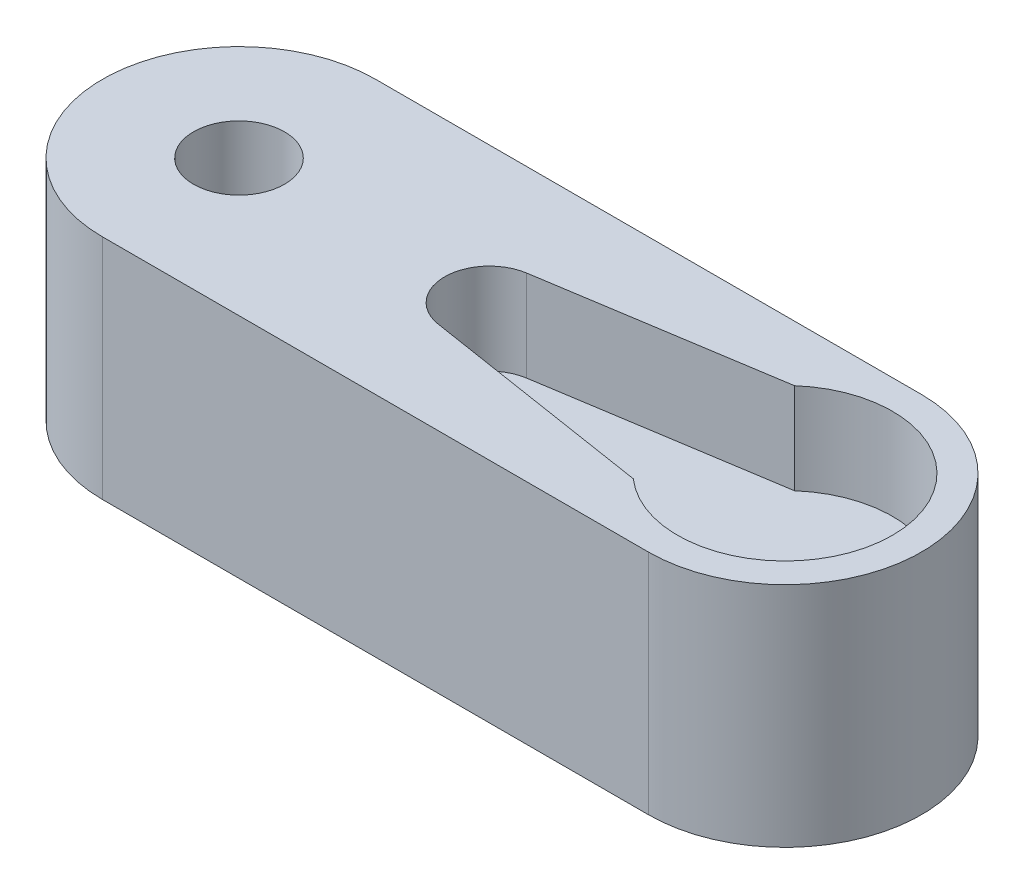
ISO-10303-21;
HEADER;
FILE_DESCRIPTION(('STEP AP214'),'2;1');
FILE_NAME('part.step','',(''),(''),'','','');
FILE_SCHEMA(('AUTOMOTIVE_DESIGN { 1 0 10303 214 1 1 1 1 }'));
ENDSEC;
DATA;
#1=APPLICATION_CONTEXT('core data for automotive mechanical design processes');
#2=APPLICATION_PROTOCOL_DEFINITION('international standard','automotive_design',2000,#1);
#3=PRODUCT_CONTEXT('',#1,'mechanical');
#4=PRODUCT('Part','Part','',(#3));
#5=PRODUCT_RELATED_PRODUCT_CATEGORY('part','',(#4));
#6=PRODUCT_DEFINITION_FORMATION('','',#4);
#7=PRODUCT_DEFINITION_CONTEXT('part definition',#1,'design');
#8=PRODUCT_DEFINITION('design','',#6,#7);
#9=PRODUCT_DEFINITION_SHAPE('','',#8);
#10=(LENGTH_UNIT() NAMED_UNIT(*) SI_UNIT(.MILLI.,.METRE.));
#11=(NAMED_UNIT(*) PLANE_ANGLE_UNIT() SI_UNIT($,.RADIAN.));
#12=(NAMED_UNIT(*) SI_UNIT($,.STERADIAN.) SOLID_ANGLE_UNIT());
#13=UNCERTAINTY_MEASURE_WITH_UNIT(LENGTH_MEASURE(1.E-05),#10,'distance_accuracy_value','');
#14=(GEOMETRIC_REPRESENTATION_CONTEXT(3) GLOBAL_UNCERTAINTY_ASSIGNED_CONTEXT((#13)) GLOBAL_UNIT_ASSIGNED_CONTEXT((#10,
#11,#12)) REPRESENTATION_CONTEXT('',''));
#15=CARTESIAN_POINT('',(0.,0.,0.));
#16=DIRECTION('',(0.,0.,1.));
#17=DIRECTION('',(1.,0.,0.));
#18=AXIS2_PLACEMENT_3D('',#15,#16,#17);
#19=CARTESIAN_POINT('',(-25.4,12.7,0.));
#20=DIRECTION('',(0.,-1.,0.));
#21=DIRECTION('',(0.,0.,-1.));
#22=AXIS2_PLACEMENT_3D('',#19,#20,#21);
#23=CYLINDRICAL_SURFACE('',#22,7.62);
#24=CARTESIAN_POINT('',(-25.4,0.,0.));
#25=DIRECTION('',(0.,1.,0.));
#26=DIRECTION('',(0.,0.,1.));
#27=AXIS2_PLACEMENT_3D('',#24,#25,#26);
#28=CIRCLE('',#27,7.62);
#29=CARTESIAN_POINT('',(-25.4,0.,-7.62));
#30=VERTEX_POINT('',#29);
#31=CARTESIAN_POINT('',(-25.4,0.,7.62));
#32=VERTEX_POINT('',#31);
#33=EDGE_CURVE('E154',#30,#32,#28,.T.);
#34=ORIENTED_EDGE('',*,*,#33,.T.);
#35=DIRECTION('',(0.,-1.,0.));
#36=VECTOR('',#35,1.);
#37=CARTESIAN_POINT('',(-25.4,12.7,7.62));
#38=LINE('',#37,#36);
#39=CARTESIAN_POINT('',(-25.4,12.7,7.62));
#40=VERTEX_POINT('',#39);
#41=EDGE_CURVE('E11',#40,#32,#38,.T.);
#42=ORIENTED_EDGE('',*,*,#41,.F.);
#43=CARTESIAN_POINT('',(-25.4,12.7,0.));
#44=DIRECTION('',(0.,1.,0.));
#45=DIRECTION('',(0.,0.,1.));
#46=AXIS2_PLACEMENT_3D('',#43,#44,#45);
#47=CIRCLE('',#46,7.62);
#48=CARTESIAN_POINT('',(-25.4,12.7,-7.62));
#49=VERTEX_POINT('',#48);
#50=EDGE_CURVE('E157',#49,#40,#47,.T.);
#51=ORIENTED_EDGE('',*,*,#50,.F.);
#52=DIRECTION('',(0.,-1.,0.));
#53=VECTOR('',#52,1.);
#54=CARTESIAN_POINT('',(-25.4,12.7,-7.62));
#55=LINE('',#54,#53);
#56=EDGE_CURVE('E163',#49,#30,#55,.T.);
#57=ORIENTED_EDGE('',*,*,#56,.T.);
#58=EDGE_LOOP('',(#34,#42,#51,#57));
#59=FACE_BOUND('',#58,.T.);
#60=ADVANCED_FACE('F39',(#59),#23,.T.);
#61=CARTESIAN_POINT('',(-25.4,12.7,7.62));
#62=DIRECTION('',(0.,0.,-1.));
#63=DIRECTION('',(-1.,0.,0.));
#64=AXIS2_PLACEMENT_3D('',#61,#62,#63);
#65=PLANE('',#64);
#66=DIRECTION('',(1.,0.,0.));
#67=VECTOR('',#66,1.);
#68=CARTESIAN_POINT('',(-25.4,0.,7.62));
#69=LINE('',#68,#67);
#70=CARTESIAN_POINT('',(5.08,0.,7.62));
#71=VERTEX_POINT('',#70);
#72=EDGE_CURVE('E166',#32,#71,#69,.T.);
#73=ORIENTED_EDGE('',*,*,#72,.T.);
#74=DIRECTION('',(0.,-1.,0.));
#75=VECTOR('',#74,1.);
#76=CARTESIAN_POINT('',(5.08,12.7,7.62));
#77=LINE('',#76,#75);
#78=CARTESIAN_POINT('',(5.08,12.7,7.62));
#79=VERTEX_POINT('',#78);
#80=EDGE_CURVE('E46',#79,#71,#77,.T.);
#81=ORIENTED_EDGE('',*,*,#80,.F.);
#82=DIRECTION('',(1.,0.,0.));
#83=VECTOR('',#82,1.);
#84=CARTESIAN_POINT('',(-25.4,12.7,7.62));
#85=LINE('',#84,#83);
#86=EDGE_CURVE('E90',#40,#79,#85,.T.);
#87=ORIENTED_EDGE('',*,*,#86,.F.);
#88=ORIENTED_EDGE('',*,*,#41,.T.);
#89=EDGE_LOOP('',(#73,#81,#87,#88));
#90=FACE_BOUND('',#89,.T.);
#91=ADVANCED_FACE('F196',(#90),#65,.F.);
#92=CARTESIAN_POINT('',(5.08,12.7,0.));
#93=DIRECTION('',(0.,-1.,0.));
#94=DIRECTION('',(0.,0.,-1.));
#95=AXIS2_PLACEMENT_3D('',#92,#93,#94);
#96=CYLINDRICAL_SURFACE('',#95,7.62);
#97=CARTESIAN_POINT('',(5.08,0.,0.));
#98=DIRECTION('',(0.,1.,0.));
#99=DIRECTION('',(0.,0.,1.));
#100=AXIS2_PLACEMENT_3D('',#97,#98,#99);
#101=CIRCLE('',#100,7.62);
#102=CARTESIAN_POINT('',(5.08,0.,-7.62));
#103=VERTEX_POINT('',#102);
#104=EDGE_CURVE('E168',#71,#103,#101,.T.);
#105=ORIENTED_EDGE('',*,*,#104,.T.);
#106=DIRECTION('',(0.,-1.,0.));
#107=VECTOR('',#106,1.);
#108=CARTESIAN_POINT('',(5.08,12.7,-7.62));
#109=LINE('',#108,#107);
#110=CARTESIAN_POINT('',(5.08,12.7,-7.62));
#111=VERTEX_POINT('',#110);
#112=EDGE_CURVE('E172',#111,#103,#109,.T.);
#113=ORIENTED_EDGE('',*,*,#112,.F.);
#114=CARTESIAN_POINT('',(5.08,12.7,0.));
#115=DIRECTION('',(0.,1.,0.));
#116=DIRECTION('',(0.,0.,1.));
#117=AXIS2_PLACEMENT_3D('',#114,#115,#116);
#118=CIRCLE('',#117,7.62);
#119=EDGE_CURVE('E160',#79,#111,#118,.T.);
#120=ORIENTED_EDGE('',*,*,#119,.F.);
#121=ORIENTED_EDGE('',*,*,#80,.T.);
#122=EDGE_LOOP('',(#105,#113,#120,#121));
#123=FACE_BOUND('',#122,.T.);
#124=ADVANCED_FACE('F177',(#123),#96,.T.);
#125=CARTESIAN_POINT('',(-25.4,12.7,-7.62));
#126=DIRECTION('',(0.,0.,1.));
#127=DIRECTION('',(1.,0.,0.));
#128=AXIS2_PLACEMENT_3D('',#125,#126,#127);
#129=PLANE('',#128);
#130=DIRECTION('',(-1.,0.,0.));
#131=VECTOR('',#130,1.);
#132=CARTESIAN_POINT('',(-25.4,0.,-7.62));
#133=LINE('',#132,#131);
#134=EDGE_CURVE('E83',#103,#30,#133,.T.);
#135=ORIENTED_EDGE('',*,*,#134,.T.);
#136=ORIENTED_EDGE('',*,*,#56,.F.);
#137=DIRECTION('',(-1.,0.,0.));
#138=VECTOR('',#137,1.);
#139=CARTESIAN_POINT('',(-25.4,12.7,-7.62));
#140=LINE('',#139,#138);
#141=EDGE_CURVE('E62',#111,#49,#140,.T.);
#142=ORIENTED_EDGE('',*,*,#141,.F.);
#143=ORIENTED_EDGE('',*,*,#112,.T.);
#144=EDGE_LOOP('',(#135,#136,#142,#143));
#145=FACE_BOUND('',#144,.T.);
#146=ADVANCED_FACE('F185',(#145),#129,.F.);
#147=CARTESIAN_POINT('',(-25.4,12.7,0.));
#148=DIRECTION('',(0.,1.,0.));
#149=DIRECTION('',(0.,0.,1.));
#150=AXIS2_PLACEMENT_3D('',#147,#148,#149);
#151=PLANE('',#150);
#152=CARTESIAN_POINT('',(-11.42000891,12.7,1.15297735712334E-13));
#153=DIRECTION('',(0.,1.,0.));
#154=DIRECTION('',(0.,0.,1.));
#155=AXIS2_PLACEMENT_3D('',#152,#153,#154);
#156=CIRCLE('',#155,2.50000135);
#157=CARTESIAN_POINT('',(-11.8081233173201,12.7,-2.46969106505892));
#158=VERTEX_POINT('',#157);
#159=CARTESIAN_POINT('',(-11.80812331732,12.7,2.46969106505915));
#160=VERTEX_POINT('',#159);
#161=EDGE_CURVE('E53',#158,#160,#156,.T.);
#162=ORIENTED_EDGE('',*,*,#161,.F.);
#163=DIRECTION('',(-0.987875892570632,0.,0.155245679095352));
#164=VECTOR('',#163,1.);
#165=CARTESIAN_POINT('',(1.11137089034438,12.7,-4.50000242999986));
#166=LINE('',#165,#164);
#167=CARTESIAN_POINT('',(1.11137089034438,12.7,-4.50000242999986));
#168=VERTEX_POINT('',#167);
#169=EDGE_CURVE('E132',#168,#158,#166,.T.);
#170=ORIENTED_EDGE('',*,*,#169,.F.);
#171=CARTESIAN_POINT('',(5.08,12.7,0.));
#172=DIRECTION('',(0.,1.,0.));
#173=DIRECTION('',(0.,0.,1.));
#174=AXIS2_PLACEMENT_3D('',#171,#172,#173);
#175=CIRCLE('',#174,6.00000324);
#176=CARTESIAN_POINT('',(1.11137089034458,12.7,4.50000243000003));
#177=VERTEX_POINT('',#176);
#178=EDGE_CURVE('E135',#177,#168,#175,.T.);
#179=ORIENTED_EDGE('',*,*,#178,.F.);
#180=DIRECTION('',(0.987875892570633,0.,0.155245679095345));
#181=VECTOR('',#180,1.);
#182=CARTESIAN_POINT('',(-11.80812331732,12.7,2.46969106505915));
#183=LINE('',#182,#181);
#184=EDGE_CURVE('E141',#160,#177,#183,.T.);
#185=ORIENTED_EDGE('',*,*,#184,.F.);
#186=EDGE_LOOP('',(#162,#170,#179,#185));
#187=FACE_BOUND('',#186,.T.);
#188=CARTESIAN_POINT('',(-25.4,12.7,0.));
#189=DIRECTION('',(0.,1.,0.));
#190=DIRECTION('',(0.,0.,1.));
#191=AXIS2_PLACEMENT_3D('',#188,#189,#190);
#192=CIRCLE('',#191,2.54);
#193=CARTESIAN_POINT('',(-25.4,12.7,2.54));
#194=VERTEX_POINT('',#193);
#195=EDGE_CURVE('E147',#194,#194,#192,.T.);
#196=ORIENTED_EDGE('',*,*,#195,.F.);
#197=EDGE_LOOP('',(#196));
#198=FACE_BOUND('',#197,.T.);
#199=ORIENTED_EDGE('',*,*,#50,.T.);
#200=ORIENTED_EDGE('',*,*,#86,.T.);
#201=ORIENTED_EDGE('',*,*,#119,.T.);
#202=ORIENTED_EDGE('',*,*,#141,.T.);
#203=EDGE_LOOP('',(#199,#200,#201,#202));
#204=FACE_BOUND('',#203,.T.);
#205=ADVANCED_FACE('F187',(#187,#198,#204),#151,.T.);
#206=CARTESIAN_POINT('',(-25.4,0.,0.));
#207=DIRECTION('',(0.,1.,0.));
#208=DIRECTION('',(0.,0.,1.));
#209=AXIS2_PLACEMENT_3D('',#206,#207,#208);
#210=PLANE('',#209);
#211=CARTESIAN_POINT('',(-25.4,0.,0.));
#212=DIRECTION('',(0.,1.,0.));
#213=DIRECTION('',(0.,0.,1.));
#214=AXIS2_PLACEMENT_3D('',#211,#212,#213);
#215=CIRCLE('',#214,2.54);
#216=CARTESIAN_POINT('',(-25.4,0.,2.54));
#217=VERTEX_POINT('',#216);
#218=EDGE_CURVE('E151',#217,#217,#215,.T.);
#219=ORIENTED_EDGE('',*,*,#218,.T.);
#220=EDGE_LOOP('',(#219));
#221=FACE_BOUND('',#220,.T.);
#222=ORIENTED_EDGE('',*,*,#33,.F.);
#223=ORIENTED_EDGE('',*,*,#134,.F.);
#224=ORIENTED_EDGE('',*,*,#104,.F.);
#225=ORIENTED_EDGE('',*,*,#72,.F.);
#226=EDGE_LOOP('',(#222,#223,#224,#225));
#227=FACE_BOUND('',#226,.T.);
#228=ADVANCED_FACE('F181',(#221,#227),#210,.F.);
#229=CARTESIAN_POINT('',(-25.4,0.,0.));
#230=DIRECTION('',(0.,1.,0.));
#231=DIRECTION('',(0.,0.,1.));
#232=AXIS2_PLACEMENT_3D('',#229,#230,#231);
#233=CYLINDRICAL_SURFACE('',#232,2.54);
#234=ORIENTED_EDGE('',*,*,#218,.F.);
#235=EDGE_LOOP('',(#234));
#236=FACE_BOUND('',#235,.T.);
#237=ORIENTED_EDGE('',*,*,#195,.T.);
#238=EDGE_LOOP('',(#237));
#239=FACE_BOUND('',#238,.T.);
#240=ADVANCED_FACE('F231',(#236,#239),#233,.F.);
#241=CARTESIAN_POINT('',(-11.42000891,7.62,1.15297735712334E-13));
#242=DIRECTION('',(0.,1.,0.));
#243=DIRECTION('',(0.,0.,1.));
#244=AXIS2_PLACEMENT_3D('',#241,#242,#243);
#245=CYLINDRICAL_SURFACE('',#244,2.50000135);
#246=ORIENTED_EDGE('',*,*,#161,.T.);
#247=DIRECTION('',(0.,1.,0.));
#248=VECTOR('',#247,1.);
#249=CARTESIAN_POINT('',(-11.80812331732,7.62,2.46969106505915));
#250=LINE('',#249,#248);
#251=CARTESIAN_POINT('',(-11.80812331732,7.62,2.46969106505915));
#252=VERTEX_POINT('',#251);
#253=EDGE_CURVE('E110',#252,#160,#250,.T.);
#254=ORIENTED_EDGE('',*,*,#253,.F.);
#255=CARTESIAN_POINT('',(-11.42000891,7.62,1.15297735712334E-13));
#256=DIRECTION('',(0.,1.,0.));
#257=DIRECTION('',(0.,0.,1.));
#258=AXIS2_PLACEMENT_3D('',#255,#256,#257);
#259=CIRCLE('',#258,2.50000135);
#260=CARTESIAN_POINT('',(-11.8081233173201,7.62,-2.46969106505892));
#261=VERTEX_POINT('',#260);
#262=EDGE_CURVE('E114',#261,#252,#259,.T.);
#263=ORIENTED_EDGE('',*,*,#262,.F.);
#264=DIRECTION('',(0.,1.,0.));
#265=VECTOR('',#264,1.);
#266=CARTESIAN_POINT('',(-11.8081233173201,7.62,-2.46969106505892));
#267=LINE('',#266,#265);
#268=EDGE_CURVE('E145',#261,#158,#267,.T.);
#269=ORIENTED_EDGE('',*,*,#268,.T.);
#270=EDGE_LOOP('',(#246,#254,#263,#269));
#271=FACE_BOUND('',#270,.T.);
#272=ADVANCED_FACE('F112',(#271),#245,.F.);
#273=CARTESIAN_POINT('',(1.11137089034438,7.62,-4.50000242999986));
#274=DIRECTION('',(-0.155245679095352,0.,-0.987875892570632));
#275=DIRECTION('',(-0.987875892570632,0.,0.155245679095352));
#276=AXIS2_PLACEMENT_3D('',#273,#274,#275);
#277=PLANE('',#276);
#278=ORIENTED_EDGE('',*,*,#169,.T.);
#279=ORIENTED_EDGE('',*,*,#268,.F.);
#280=DIRECTION('',(-0.987875892570632,0.,0.155245679095352));
#281=VECTOR('',#280,1.);
#282=CARTESIAN_POINT('',(1.11137089034438,7.62,-4.50000242999986));
#283=LINE('',#282,#281);
#284=CARTESIAN_POINT('',(1.11137089034438,7.62,-4.50000242999986));
#285=VERTEX_POINT('',#284);
#286=EDGE_CURVE('E120',#285,#261,#283,.T.);
#287=ORIENTED_EDGE('',*,*,#286,.F.);
#288=DIRECTION('',(0.,1.,0.));
#289=VECTOR('',#288,1.);
#290=CARTESIAN_POINT('',(1.11137089034438,7.62,-4.50000242999986));
#291=LINE('',#290,#289);
#292=EDGE_CURVE('E148',#285,#168,#291,.T.);
#293=ORIENTED_EDGE('',*,*,#292,.T.);
#294=EDGE_LOOP('',(#278,#279,#287,#293));
#295=FACE_BOUND('',#294,.T.);
#296=ADVANCED_FACE('F247',(#295),#277,.F.);
#297=CARTESIAN_POINT('',(5.08,7.62,0.));
#298=DIRECTION('',(0.,1.,0.));
#299=DIRECTION('',(0.,0.,1.));
#300=AXIS2_PLACEMENT_3D('',#297,#298,#299);
#301=CYLINDRICAL_SURFACE('',#300,6.00000324);
#302=ORIENTED_EDGE('',*,*,#178,.T.);
#303=ORIENTED_EDGE('',*,*,#292,.F.);
#304=CARTESIAN_POINT('',(5.08,7.62,0.));
#305=DIRECTION('',(0.,1.,0.));
#306=DIRECTION('',(0.,0.,1.));
#307=AXIS2_PLACEMENT_3D('',#304,#305,#306);
#308=CIRCLE('',#307,6.00000324);
#309=CARTESIAN_POINT('',(1.11137089034458,7.62,4.50000243000003));
#310=VERTEX_POINT('',#309);
#311=EDGE_CURVE('E128',#310,#285,#308,.T.);
#312=ORIENTED_EDGE('',*,*,#311,.F.);
#313=DIRECTION('',(0.,1.,0.));
#314=VECTOR('',#313,1.);
#315=CARTESIAN_POINT('',(1.11137089034458,7.62,4.50000243000003));
#316=LINE('',#315,#314);
#317=EDGE_CURVE('E119',#310,#177,#316,.T.);
#318=ORIENTED_EDGE('',*,*,#317,.T.);
#319=EDGE_LOOP('',(#302,#303,#312,#318));
#320=FACE_BOUND('',#319,.T.);
#321=ADVANCED_FACE('F256',(#320),#301,.F.);
#322=CARTESIAN_POINT('',(-11.80812331732,7.62,2.46969106505915));
#323=DIRECTION('',(-0.155245679095345,0.,0.987875892570633));
#324=DIRECTION('',(0.987875892570633,0.,0.155245679095345));
#325=AXIS2_PLACEMENT_3D('',#322,#323,#324);
#326=PLANE('',#325);
#327=ORIENTED_EDGE('',*,*,#184,.T.);
#328=ORIENTED_EDGE('',*,*,#317,.F.);
#329=DIRECTION('',(0.987875892570633,0.,0.155245679095345));
#330=VECTOR('',#329,1.);
#331=CARTESIAN_POINT('',(-11.80812331732,7.62,2.46969106505915));
#332=LINE('',#331,#330);
#333=EDGE_CURVE('E123',#252,#310,#332,.T.);
#334=ORIENTED_EDGE('',*,*,#333,.F.);
#335=ORIENTED_EDGE('',*,*,#253,.T.);
#336=EDGE_LOOP('',(#327,#328,#334,#335));
#337=FACE_BOUND('',#336,.T.);
#338=ADVANCED_FACE('F124',(#337),#326,.F.);
#339=CARTESIAN_POINT('',(-11.42000891,7.62,1.15297735712334E-13));
#340=DIRECTION('',(0.,1.,0.));
#341=DIRECTION('',(0.,0.,1.));
#342=AXIS2_PLACEMENT_3D('',#339,#340,#341);
#343=PLANE('',#342);
#344=ORIENTED_EDGE('',*,*,#262,.T.);
#345=ORIENTED_EDGE('',*,*,#333,.T.);
#346=ORIENTED_EDGE('',*,*,#311,.T.);
#347=ORIENTED_EDGE('',*,*,#286,.T.);
#348=EDGE_LOOP('',(#344,#345,#346,#347));
#349=FACE_BOUND('',#348,.T.);
#350=ADVANCED_FACE('F130',(#349),#343,.T.);
#351=CLOSED_SHELL('',(#60,#91,#124,#146,#205,#228,#240,#272,#296,#321,#338,#350));
#352=MANIFOLD_SOLID_BREP('B2',#351);
#353=ADVANCED_BREP_SHAPE_REPRESENTATION('',(#18,#352),#14);
#354=SHAPE_DEFINITION_REPRESENTATION(#9,#353);
ENDSEC;
END-ISO-10303-21;
